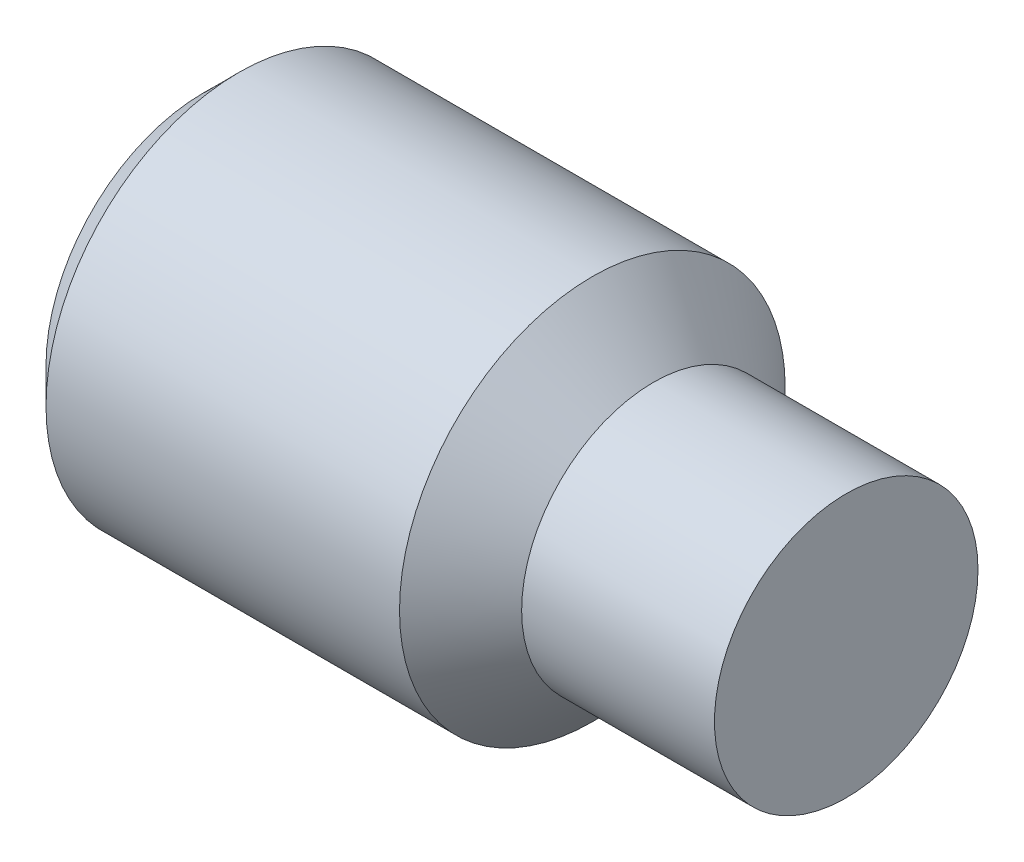
ISO-10303-21;
HEADER;
FILE_DESCRIPTION(('STEP AP214'),'2;1');
FILE_NAME('part.step','',(''),(''),'','','');
FILE_SCHEMA(('AUTOMOTIVE_DESIGN { 1 0 10303 214 1 1 1 1 }'));
ENDSEC;
DATA;
#1=APPLICATION_CONTEXT('core data for automotive mechanical design processes');
#2=APPLICATION_PROTOCOL_DEFINITION('international standard','automotive_design',2000,#1);
#3=PRODUCT_CONTEXT('',#1,'mechanical');
#4=PRODUCT('Part','Part','',(#3));
#5=PRODUCT_RELATED_PRODUCT_CATEGORY('part','',(#4));
#6=PRODUCT_DEFINITION_FORMATION('','',#4);
#7=PRODUCT_DEFINITION_CONTEXT('part definition',#1,'design');
#8=PRODUCT_DEFINITION('design','',#6,#7);
#9=PRODUCT_DEFINITION_SHAPE('','',#8);
#10=(LENGTH_UNIT() NAMED_UNIT(*) SI_UNIT(.MILLI.,.METRE.));
#11=(NAMED_UNIT(*) PLANE_ANGLE_UNIT() SI_UNIT($,.RADIAN.));
#12=(NAMED_UNIT(*) SI_UNIT($,.STERADIAN.) SOLID_ANGLE_UNIT());
#13=UNCERTAINTY_MEASURE_WITH_UNIT(LENGTH_MEASURE(1.E-05),#10,'distance_accuracy_value','');
#14=(GEOMETRIC_REPRESENTATION_CONTEXT(3) GLOBAL_UNCERTAINTY_ASSIGNED_CONTEXT((#13)) GLOBAL_UNIT_ASSIGNED_CONTEXT((#10,
#11,#12)) REPRESENTATION_CONTEXT('',''));
#15=CARTESIAN_POINT('',(0.,0.,0.));
#16=DIRECTION('',(0.,0.,1.));
#17=DIRECTION('',(1.,0.,0.));
#18=AXIS2_PLACEMENT_3D('',#15,#16,#17);
#19=CARTESIAN_POINT('',(20.,0.,0.));
#20=DIRECTION('',(-1.,0.,0.));
#21=DIRECTION('',(0.,0.,1.));
#22=AXIS2_PLACEMENT_3D('',#19,#20,#21);
#23=CYLINDRICAL_SURFACE('',#22,6.);
#24=CARTESIAN_POINT('',(12.1,0.,0.));
#25=DIRECTION('',(-1.,0.,0.));
#26=DIRECTION('',(0.,0.,1.));
#27=AXIS2_PLACEMENT_3D('',#24,#25,#26);
#28=CIRCLE('',#27,6.);
#29=CARTESIAN_POINT('',(12.1,0.,6.));
#30=VERTEX_POINT('',#29);
#31=EDGE_CURVE('E188',#30,#30,#28,.T.);
#32=ORIENTED_EDGE('',*,*,#31,.T.);
#33=EDGE_LOOP('',(#32));
#34=FACE_BOUND('',#33,.T.);
#35=CARTESIAN_POINT('',(1.09999999999999,0.,0.));
#36=DIRECTION('',(-1.,0.,0.));
#37=DIRECTION('',(0.,0.,1.));
#38=AXIS2_PLACEMENT_3D('',#35,#36,#37);
#39=CIRCLE('',#38,6.);
#40=CARTESIAN_POINT('',(1.09999999999999,0.,6.));
#41=VERTEX_POINT('',#40);
#42=EDGE_CURVE('E174',#41,#41,#39,.T.);
#43=ORIENTED_EDGE('',*,*,#42,.F.);
#44=EDGE_LOOP('',(#43));
#45=FACE_BOUND('',#44,.T.);
#46=ADVANCED_FACE('F29',(#34,#45),#23,.T.);
#47=CARTESIAN_POINT('',(14.,0.,0.));
#48=DIRECTION('',(-1.,0.,0.));
#49=DIRECTION('',(0.,0.,1.));
#50=AXIS2_PLACEMENT_3D('',#47,#48,#49);
#51=CONICAL_SURFACE('',#50,4.1,0.785398163397454);
#52=ORIENTED_EDGE('',*,*,#31,.F.);
#53=EDGE_LOOP('',(#52));
#54=FACE_BOUND('',#53,.T.);
#55=CARTESIAN_POINT('',(14.,0.,0.));
#56=DIRECTION('',(-1.,0.,0.));
#57=DIRECTION('',(0.,0.,1.));
#58=AXIS2_PLACEMENT_3D('',#55,#56,#57);
#59=CIRCLE('',#58,4.1);
#60=CARTESIAN_POINT('',(14.,0.,4.1));
#61=VERTEX_POINT('',#60);
#62=EDGE_CURVE('E185',#61,#61,#59,.T.);
#63=ORIENTED_EDGE('',*,*,#62,.T.);
#64=EDGE_LOOP('',(#63));
#65=FACE_BOUND('',#64,.T.);
#66=ADVANCED_FACE('F238',(#54,#65),#51,.T.);
#67=CARTESIAN_POINT('',(20.,0.,0.));
#68=DIRECTION('',(1.,0.,0.));
#69=DIRECTION('',(0.,0.,-1.));
#70=AXIS2_PLACEMENT_3D('',#67,#68,#69);
#71=PLANE('',#70);
#72=CARTESIAN_POINT('',(20.,0.,0.));
#73=DIRECTION('',(1.,0.,0.));
#74=DIRECTION('',(0.,0.,-1.));
#75=AXIS2_PLACEMENT_3D('',#72,#73,#74);
#76=CIRCLE('',#75,4.1);
#77=CARTESIAN_POINT('',(20.,0.,-4.1));
#78=VERTEX_POINT('',#77);
#79=EDGE_CURVE('E191',#78,#78,#76,.T.);
#80=ORIENTED_EDGE('',*,*,#79,.T.);
#81=EDGE_LOOP('',(#80));
#82=FACE_BOUND('',#81,.T.);
#83=ADVANCED_FACE('F244',(#82),#71,.T.);
#84=CARTESIAN_POINT('',(14.,0.,0.));
#85=DIRECTION('',(1.,0.,0.));
#86=DIRECTION('',(0.,0.,-1.));
#87=AXIS2_PLACEMENT_3D('',#84,#85,#86);
#88=CYLINDRICAL_SURFACE('',#87,4.1);
#89=ORIENTED_EDGE('',*,*,#62,.F.);
#90=EDGE_LOOP('',(#89));
#91=FACE_BOUND('',#90,.T.);
#92=ORIENTED_EDGE('',*,*,#79,.F.);
#93=EDGE_LOOP('',(#92));
#94=FACE_BOUND('',#93,.T.);
#95=ADVANCED_FACE('F253',(#91,#94),#88,.T.);
#96=CARTESIAN_POINT('',(0.,0.,0.));
#97=DIRECTION('',(1.,0.,0.));
#98=DIRECTION('',(0.,0.,-1.));
#99=AXIS2_PLACEMENT_3D('',#96,#97,#98);
#100=CONICAL_SURFACE('',#99,4.9,0.785398163397454);
#101=ORIENTED_EDGE('',*,*,#42,.T.);
#102=EDGE_LOOP('',(#101));
#103=FACE_BOUND('',#102,.T.);
#104=CARTESIAN_POINT('',(0.,0.,0.));
#105=DIRECTION('',(-1.,0.,0.));
#106=DIRECTION('',(0.,0.,1.));
#107=AXIS2_PLACEMENT_3D('',#104,#105,#106);
#108=CIRCLE('',#107,4.9);
#109=CARTESIAN_POINT('',(0.,0.,4.9));
#110=VERTEX_POINT('',#109);
#111=EDGE_CURVE('E177',#110,#110,#108,.T.);
#112=ORIENTED_EDGE('',*,*,#111,.F.);
#113=EDGE_LOOP('',(#112));
#114=FACE_BOUND('',#113,.T.);
#115=ADVANCED_FACE('F251',(#103,#114),#100,.T.);
#116=CARTESIAN_POINT('',(8.,-13.3414213562373,0.));
#117=DIRECTION('',(-1.,0.,0.));
#118=DIRECTION('',(0.,0.,1.));
#119=AXIS2_PLACEMENT_3D('',#116,#117,#118);
#120=PLANE('',#119);
#121=DIRECTION('',(0.,-0.499999999999998,-0.86602540378444));
#122=VECTOR('',#121,1.);
#123=CARTESIAN_POINT('',(8.,-1.6033045314904,-6.77700490854686));
#124=LINE('',#123,#122);
#125=CARTESIAN_POINT('',(8.,2.30940107675852,0.));
#126=VERTEX_POINT('',#125);
#127=CARTESIAN_POINT('',(8.,1.15470053837927,-2.));
#128=VERTEX_POINT('',#127);
#129=EDGE_CURVE('E145',#126,#128,#124,.T.);
#130=ORIENTED_EDGE('',*,*,#129,.T.);
#131=DIRECTION('',(0.,-1.,0.));
#132=VECTOR('',#131,1.);
#133=CARTESIAN_POINT('',(8.,-13.3414213562373,-2.));
#134=LINE('',#133,#132);
#135=CARTESIAN_POINT('',(8.,-1.15470053837927,-2.));
#136=VERTEX_POINT('',#135);
#137=EDGE_CURVE('E147',#128,#136,#134,.T.);
#138=ORIENTED_EDGE('',*,*,#137,.T.);
#139=DIRECTION('',(0.,-0.499999999999998,0.86602540378444));
#140=VECTOR('',#139,1.);
#141=CARTESIAN_POINT('',(8.,-5.06740614662819,4.77700490854686));
#142=LINE('',#141,#140);
#143=CARTESIAN_POINT('',(8.,-2.30940107675852,0.));
#144=VERTEX_POINT('',#143);
#145=EDGE_CURVE('E131',#136,#144,#142,.T.);
#146=ORIENTED_EDGE('',*,*,#145,.T.);
#147=DIRECTION('',(0.,0.499999999999998,0.86602540378444));
#148=VECTOR('',#147,1.);
#149=CARTESIAN_POINT('',(8.,-5.06740614662819,-4.77700490854686));
#150=LINE('',#149,#148);
#151=CARTESIAN_POINT('',(8.,-1.15470053837927,2.));
#152=VERTEX_POINT('',#151);
#153=EDGE_CURVE('E139',#144,#152,#150,.T.);
#154=ORIENTED_EDGE('',*,*,#153,.T.);
#155=DIRECTION('',(0.,1.,0.));
#156=VECTOR('',#155,1.);
#157=CARTESIAN_POINT('',(8.,-13.3414213562373,2.));
#158=LINE('',#157,#156);
#159=CARTESIAN_POINT('',(8.,1.15470053837927,2.));
#160=VERTEX_POINT('',#159);
#161=EDGE_CURVE('E141',#152,#160,#158,.T.);
#162=ORIENTED_EDGE('',*,*,#161,.T.);
#163=DIRECTION('',(0.,0.499999999999998,-0.86602540378444));
#164=VECTOR('',#163,1.);
#165=CARTESIAN_POINT('',(8.,-1.60330453149041,6.77700490854686));
#166=LINE('',#165,#164);
#167=EDGE_CURVE('E143',#160,#126,#166,.T.);
#168=ORIENTED_EDGE('',*,*,#167,.T.);
#169=EDGE_LOOP('',(#130,#138,#146,#154,#162,#168));
#170=FACE_BOUND('',#169,.T.);
#171=ADVANCED_FACE('F226',(#170),#120,.T.);
#172=CARTESIAN_POINT('',(8.,-13.3414213562373,3.));
#173=DIRECTION('',(0.,0.,1.));
#174=DIRECTION('',(1.,0.,0.));
#175=AXIS2_PLACEMENT_3D('',#172,#173,#174);
#176=PLANE('',#175);
#177=DIRECTION('',(-1.,0.,0.));
#178=VECTOR('',#177,1.);
#179=CARTESIAN_POINT('',(8.,1.73205080756889,3.));
#180=LINE('',#179,#178);
#181=CARTESIAN_POINT('',(7.,1.73205080756889,3.));
#182=VERTEX_POINT('',#181);
#183=CARTESIAN_POINT('',(0.,1.73205080756889,3.));
#184=VERTEX_POINT('',#183);
#185=EDGE_CURVE('E103',#182,#184,#180,.T.);
#186=ORIENTED_EDGE('',*,*,#185,.F.);
#187=DIRECTION('',(0.,1.,0.));
#188=VECTOR('',#187,1.);
#189=CARTESIAN_POINT('',(7.,-13.3414213562373,3.));
#190=LINE('',#189,#188);
#191=CARTESIAN_POINT('',(7.,-1.7320508075689,3.));
#192=VERTEX_POINT('',#191);
#193=EDGE_CURVE('E50',#182,#192,#190,.F.);
#194=ORIENTED_EDGE('',*,*,#193,.T.);
#195=DIRECTION('',(-1.,0.,0.));
#196=VECTOR('',#195,1.);
#197=CARTESIAN_POINT('',(8.,-1.7320508075689,3.));
#198=LINE('',#197,#196);
#199=CARTESIAN_POINT('',(0.,-1.7320508075689,3.));
#200=VERTEX_POINT('',#199);
#201=EDGE_CURVE('E96',#192,#200,#198,.T.);
#202=ORIENTED_EDGE('',*,*,#201,.T.);
#203=DIRECTION('',(0.,1.,0.));
#204=VECTOR('',#203,1.);
#205=CARTESIAN_POINT('',(0.,-13.3414213562373,3.));
#206=LINE('',#205,#204);
#207=EDGE_CURVE('E100',#200,#184,#206,.T.);
#208=ORIENTED_EDGE('',*,*,#207,.T.);
#209=EDGE_LOOP('',(#186,#194,#202,#208));
#210=FACE_BOUND('',#209,.T.);
#211=ADVANCED_FACE('F98',(#210),#176,.F.);
#212=CARTESIAN_POINT('',(8.,-0.737279127705975,7.27700490854686));
#213=DIRECTION('',(0.,0.86602540378444,0.499999999999998));
#214=DIRECTION('',(0.,-0.499999999999998,0.86602540378444));
#215=AXIS2_PLACEMENT_3D('',#212,#213,#214);
#216=PLANE('',#215);
#217=DIRECTION('',(-1.,0.,0.));
#218=VECTOR('',#217,1.);
#219=CARTESIAN_POINT('',(8.,3.46410161513777,0.));
#220=LINE('',#219,#218);
#221=CARTESIAN_POINT('',(7.,3.46410161513777,0.));
#222=VERTEX_POINT('',#221);
#223=CARTESIAN_POINT('',(0.,3.46410161513777,0.));
#224=VERTEX_POINT('',#223);
#225=EDGE_CURVE('E134',#222,#224,#220,.T.);
#226=ORIENTED_EDGE('',*,*,#225,.F.);
#227=DIRECTION('',(0.,0.499999999999998,-0.86602540378444));
#228=VECTOR('',#227,1.);
#229=CARTESIAN_POINT('',(7.,-0.737279127705975,7.27700490854686));
#230=LINE('',#229,#228);
#231=EDGE_CURVE('E155',#222,#182,#230,.F.);
#232=ORIENTED_EDGE('',*,*,#231,.T.);
#233=ORIENTED_EDGE('',*,*,#185,.T.);
#234=DIRECTION('',(0.,0.499999999999998,-0.86602540378444));
#235=VECTOR('',#234,1.);
#236=CARTESIAN_POINT('',(0.,-0.737279127705975,7.27700490854686));
#237=LINE('',#236,#235);
#238=EDGE_CURVE('E118',#184,#224,#237,.T.);
#239=ORIENTED_EDGE('',*,*,#238,.T.);
#240=EDGE_LOOP('',(#226,#232,#233,#239));
#241=FACE_BOUND('',#240,.T.);
#242=ADVANCED_FACE('F160',(#241),#216,.F.);
#243=CARTESIAN_POINT('',(8.,-0.737279127705962,-7.27700490854685));
#244=DIRECTION('',(0.,0.86602540378444,-0.499999999999998));
#245=DIRECTION('',(0.,0.499999999999998,0.86602540378444));
#246=AXIS2_PLACEMENT_3D('',#243,#244,#245);
#247=PLANE('',#246);
#248=DIRECTION('',(-1.,0.,0.));
#249=VECTOR('',#248,1.);
#250=CARTESIAN_POINT('',(8.,1.7320508075689,-3.));
#251=LINE('',#250,#249);
#252=CARTESIAN_POINT('',(7.,1.7320508075689,-3.));
#253=VERTEX_POINT('',#252);
#254=CARTESIAN_POINT('',(0.,1.7320508075689,-3.));
#255=VERTEX_POINT('',#254);
#256=EDGE_CURVE('E132',#253,#255,#251,.T.);
#257=ORIENTED_EDGE('',*,*,#256,.F.);
#258=DIRECTION('',(0.,-0.499999999999998,-0.86602540378444));
#259=VECTOR('',#258,1.);
#260=CARTESIAN_POINT('',(7.,-0.737279127705962,-7.27700490854685));
#261=LINE('',#260,#259);
#262=EDGE_CURVE('E153',#253,#222,#261,.F.);
#263=ORIENTED_EDGE('',*,*,#262,.T.);
#264=ORIENTED_EDGE('',*,*,#225,.T.);
#265=DIRECTION('',(0.,-0.499999999999998,-0.86602540378444));
#266=VECTOR('',#265,1.);
#267=CARTESIAN_POINT('',(0.,-0.737279127705962,-7.27700490854685));
#268=LINE('',#267,#266);
#269=EDGE_CURVE('E120',#224,#255,#268,.T.);
#270=ORIENTED_EDGE('',*,*,#269,.T.);
#271=EDGE_LOOP('',(#257,#263,#264,#270));
#272=FACE_BOUND('',#271,.T.);
#273=ADVANCED_FACE('F203',(#272),#247,.F.);
#274=CARTESIAN_POINT('',(8.,-13.3414213562373,-3.));
#275=DIRECTION('',(0.,0.,-1.));
#276=DIRECTION('',(-1.,0.,0.));
#277=AXIS2_PLACEMENT_3D('',#274,#275,#276);
#278=PLANE('',#277);
#279=DIRECTION('',(-1.,0.,0.));
#280=VECTOR('',#279,1.);
#281=CARTESIAN_POINT('',(8.,-1.7320508075689,-3.));
#282=LINE('',#281,#280);
#283=CARTESIAN_POINT('',(7.,-1.7320508075689,-3.));
#284=VERTEX_POINT('',#283);
#285=CARTESIAN_POINT('',(0.,-1.7320508075689,-3.));
#286=VERTEX_POINT('',#285);
#287=EDGE_CURVE('E129',#284,#286,#282,.T.);
#288=ORIENTED_EDGE('',*,*,#287,.F.);
#289=DIRECTION('',(0.,-1.,0.));
#290=VECTOR('',#289,1.);
#291=CARTESIAN_POINT('',(7.,-13.3414213562373,-3.));
#292=LINE('',#291,#290);
#293=EDGE_CURVE('E150',#284,#253,#292,.F.);
#294=ORIENTED_EDGE('',*,*,#293,.T.);
#295=ORIENTED_EDGE('',*,*,#256,.T.);
#296=DIRECTION('',(0.,-1.,0.));
#297=VECTOR('',#296,1.);
#298=CARTESIAN_POINT('',(0.,-13.3414213562373,-3.));
#299=LINE('',#298,#297);
#300=EDGE_CURVE('E126',#255,#286,#299,.T.);
#301=ORIENTED_EDGE('',*,*,#300,.T.);
#302=EDGE_LOOP('',(#288,#294,#295,#301));
#303=FACE_BOUND('',#302,.T.);
#304=ADVANCED_FACE('F199',(#303),#278,.F.);
#305=CARTESIAN_POINT('',(8.,-5.93343155041263,4.27700490854686));
#306=DIRECTION('',(0.,-0.86602540378444,-0.499999999999998));
#307=DIRECTION('',(0.,0.499999999999998,-0.86602540378444));
#308=AXIS2_PLACEMENT_3D('',#305,#306,#307);
#309=PLANE('',#308);
#310=DIRECTION('',(-1.,0.,0.));
#311=VECTOR('',#310,1.);
#312=CARTESIAN_POINT('',(8.,-3.46410161513776,0.));
#313=LINE('',#312,#311);
#314=CARTESIAN_POINT('',(7.,-3.46410161513776,0.));
#315=VERTEX_POINT('',#314);
#316=CARTESIAN_POINT('',(0.,-3.46410161513777,0.));
#317=VERTEX_POINT('',#316);
#318=EDGE_CURVE('E104',#315,#317,#313,.T.);
#319=ORIENTED_EDGE('',*,*,#318,.F.);
#320=DIRECTION('',(0.,-0.499999999999998,0.86602540378444));
#321=VECTOR('',#320,1.);
#322=CARTESIAN_POINT('',(7.,-5.93343155041263,4.27700490854686));
#323=LINE('',#322,#321);
#324=EDGE_CURVE('E11',#315,#284,#323,.F.);
#325=ORIENTED_EDGE('',*,*,#324,.T.);
#326=ORIENTED_EDGE('',*,*,#287,.T.);
#327=DIRECTION('',(0.,-0.499999999999998,0.86602540378444));
#328=VECTOR('',#327,1.);
#329=CARTESIAN_POINT('',(0.,-5.93343155041263,4.27700490854686));
#330=LINE('',#329,#328);
#331=EDGE_CURVE('E112',#286,#317,#330,.T.);
#332=ORIENTED_EDGE('',*,*,#331,.T.);
#333=EDGE_LOOP('',(#319,#325,#326,#332));
#334=FACE_BOUND('',#333,.T.);
#335=ADVANCED_FACE('F194',(#334),#309,.F.);
#336=CARTESIAN_POINT('',(8.,-5.93343155041263,-4.27700490854686));
#337=DIRECTION('',(0.,-0.86602540378444,0.499999999999998));
#338=DIRECTION('',(0.,-0.499999999999998,-0.86602540378444));
#339=AXIS2_PLACEMENT_3D('',#336,#337,#338);
#340=PLANE('',#339);
#341=ORIENTED_EDGE('',*,*,#201,.F.);
#342=DIRECTION('',(0.,0.499999999999998,0.86602540378444));
#343=VECTOR('',#342,1.);
#344=CARTESIAN_POINT('',(7.,-5.93343155041263,-4.27700490854686));
#345=LINE('',#344,#343);
#346=EDGE_CURVE('E36',#192,#315,#345,.F.);
#347=ORIENTED_EDGE('',*,*,#346,.T.);
#348=ORIENTED_EDGE('',*,*,#318,.T.);
#349=DIRECTION('',(0.,0.499999999999998,0.86602540378444));
#350=VECTOR('',#349,1.);
#351=CARTESIAN_POINT('',(0.,-5.93343155041263,-4.27700490854686));
#352=LINE('',#351,#350);
#353=EDGE_CURVE('E107',#317,#200,#352,.T.);
#354=ORIENTED_EDGE('',*,*,#353,.T.);
#355=EDGE_LOOP('',(#341,#347,#348,#354));
#356=FACE_BOUND('',#355,.T.);
#357=ADVANCED_FACE('F108',(#356),#340,.F.);
#358=CARTESIAN_POINT('',(0.,0.,0.));
#359=DIRECTION('',(1.,0.,0.));
#360=DIRECTION('',(0.,0.,-1.));
#361=AXIS2_PLACEMENT_3D('',#358,#359,#360);
#362=PLANE('',#361);
#363=ORIENTED_EDGE('',*,*,#353,.F.);
#364=ORIENTED_EDGE('',*,*,#331,.F.);
#365=ORIENTED_EDGE('',*,*,#300,.F.);
#366=ORIENTED_EDGE('',*,*,#269,.F.);
#367=ORIENTED_EDGE('',*,*,#238,.F.);
#368=ORIENTED_EDGE('',*,*,#207,.F.);
#369=EDGE_LOOP('',(#363,#364,#365,#366,#367,#368));
#370=FACE_BOUND('',#369,.T.);
#371=ORIENTED_EDGE('',*,*,#111,.T.);
#372=EDGE_LOOP('',(#371));
#373=FACE_BOUND('',#372,.T.);
#374=ADVANCED_FACE('F114',(#370,#373),#362,.F.);
#375=CARTESIAN_POINT('',(7.,-13.3414213562373,2.));
#376=DIRECTION('',(0.,1.,0.));
#377=DIRECTION('',(0.,0.,1.));
#378=AXIS2_PLACEMENT_3D('',#375,#376,#377);
#379=CYLINDRICAL_SURFACE('',#378,1.);
#380=CARTESIAN_POINT('',(7.,-1.15470053837927,2.));
#381=DIRECTION('',(0.,0.866025403784438,0.500000000000001));
#382=DIRECTION('',(0.,0.500000000000001,-0.866025403784438));
#383=AXIS2_PLACEMENT_3D('',#380,#381,#382);
#384=ELLIPSE('',#383,1.15470053837925,1.);
#385=EDGE_CURVE('E172',#192,#152,#384,.T.);
#386=ORIENTED_EDGE('',*,*,#385,.F.);
#387=ORIENTED_EDGE('',*,*,#193,.F.);
#388=CARTESIAN_POINT('',(7.,1.15470053837927,2.));
#389=DIRECTION('',(0.,0.866025403784438,-0.500000000000001));
#390=DIRECTION('',(0.,-0.500000000000001,-0.866025403784438));
#391=AXIS2_PLACEMENT_3D('',#388,#389,#390);
#392=ELLIPSE('',#391,1.15470053837925,1.);
#393=EDGE_CURVE('E169',#160,#182,#392,.F.);
#394=ORIENTED_EDGE('',*,*,#393,.F.);
#395=ORIENTED_EDGE('',*,*,#161,.F.);
#396=EDGE_LOOP('',(#386,#387,#394,#395));
#397=FACE_BOUND('',#396,.T.);
#398=ADVANCED_FACE('F167',(#397),#379,.F.);
#399=CARTESIAN_POINT('',(7.,-1.60330453149041,6.77700490854686));
#400=DIRECTION('',(0.,0.499999999999998,-0.86602540378444));
#401=DIRECTION('',(0.,0.86602540378444,0.499999999999998));
#402=AXIS2_PLACEMENT_3D('',#399,#400,#401);
#403=CYLINDRICAL_SURFACE('',#402,1.);
#404=ORIENTED_EDGE('',*,*,#393,.T.);
#405=ORIENTED_EDGE('',*,*,#231,.F.);
#406=CARTESIAN_POINT('',(7.,2.30940107675852,0.));
#407=DIRECTION('',(0.,0.,-1.));
#408=DIRECTION('',(0.,-1.,0.));
#409=AXIS2_PLACEMENT_3D('',#406,#407,#408);
#410=ELLIPSE('',#409,1.15470053837925,1.);
#411=EDGE_CURVE('E179',#126,#222,#410,.F.);
#412=ORIENTED_EDGE('',*,*,#411,.F.);
#413=ORIENTED_EDGE('',*,*,#167,.F.);
#414=EDGE_LOOP('',(#404,#405,#412,#413));
#415=FACE_BOUND('',#414,.T.);
#416=ADVANCED_FACE('F173',(#415),#403,.F.);
#417=CARTESIAN_POINT('',(7.,-5.06740614662819,-4.77700490854686));
#418=DIRECTION('',(0.,0.499999999999998,0.86602540378444));
#419=DIRECTION('',(0.,-0.86602540378444,0.499999999999998));
#420=AXIS2_PLACEMENT_3D('',#417,#418,#419);
#421=CYLINDRICAL_SURFACE('',#420,1.);
#422=ORIENTED_EDGE('',*,*,#385,.T.);
#423=ORIENTED_EDGE('',*,*,#153,.F.);
#424=CARTESIAN_POINT('',(7.,-2.30940107675851,0.));
#425=DIRECTION('',(0.,0.,1.));
#426=DIRECTION('',(0.,1.,0.));
#427=AXIS2_PLACEMENT_3D('',#424,#425,#426);
#428=ELLIPSE('',#427,1.15470053837925,1.);
#429=EDGE_CURVE('E211',#315,#144,#428,.T.);
#430=ORIENTED_EDGE('',*,*,#429,.F.);
#431=ORIENTED_EDGE('',*,*,#346,.F.);
#432=EDGE_LOOP('',(#422,#423,#430,#431));
#433=FACE_BOUND('',#432,.T.);
#434=ADVANCED_FACE('F228',(#433),#421,.F.);
#435=CARTESIAN_POINT('',(7.,-1.6033045314904,-6.77700490854686));
#436=DIRECTION('',(0.,-0.499999999999998,-0.86602540378444));
#437=DIRECTION('',(0.,0.86602540378444,-0.499999999999998));
#438=AXIS2_PLACEMENT_3D('',#435,#436,#437);
#439=CYLINDRICAL_SURFACE('',#438,1.);
#440=ORIENTED_EDGE('',*,*,#411,.T.);
#441=ORIENTED_EDGE('',*,*,#262,.F.);
#442=CARTESIAN_POINT('',(7.,1.15470053837927,-2.));
#443=DIRECTION('',(0.,-0.866025403784438,-0.500000000000001));
#444=DIRECTION('',(0.,-0.500000000000001,0.866025403784438));
#445=AXIS2_PLACEMENT_3D('',#442,#443,#444);
#446=ELLIPSE('',#445,1.15470053837925,1.);
#447=EDGE_CURVE('E209',#128,#253,#446,.F.);
#448=ORIENTED_EDGE('',*,*,#447,.F.);
#449=ORIENTED_EDGE('',*,*,#129,.F.);
#450=EDGE_LOOP('',(#440,#441,#448,#449));
#451=FACE_BOUND('',#450,.T.);
#452=ADVANCED_FACE('F207',(#451),#439,.F.);
#453=CARTESIAN_POINT('',(7.,-5.06740614662819,4.77700490854685));
#454=DIRECTION('',(0.,-0.499999999999998,0.86602540378444));
#455=DIRECTION('',(0.,-0.86602540378444,-0.499999999999998));
#456=AXIS2_PLACEMENT_3D('',#453,#454,#455);
#457=CYLINDRICAL_SURFACE('',#456,1.);
#458=ORIENTED_EDGE('',*,*,#429,.T.);
#459=ORIENTED_EDGE('',*,*,#145,.F.);
#460=CARTESIAN_POINT('',(7.,-1.15470053837927,-2.));
#461=DIRECTION('',(0.,-0.866025403784438,0.500000000000001));
#462=DIRECTION('',(0.,-0.500000000000001,-0.866025403784438));
#463=AXIS2_PLACEMENT_3D('',#460,#461,#462);
#464=ELLIPSE('',#463,1.15470053837925,1.);
#465=EDGE_CURVE('E216',#284,#136,#464,.T.);
#466=ORIENTED_EDGE('',*,*,#465,.F.);
#467=ORIENTED_EDGE('',*,*,#324,.F.);
#468=EDGE_LOOP('',(#458,#459,#466,#467));
#469=FACE_BOUND('',#468,.T.);
#470=ADVANCED_FACE('F223',(#469),#457,.F.);
#471=CARTESIAN_POINT('',(7.,-13.3414213562373,-2.));
#472=DIRECTION('',(0.,-1.,0.));
#473=DIRECTION('',(0.,0.,-1.));
#474=AXIS2_PLACEMENT_3D('',#471,#472,#473);
#475=CYLINDRICAL_SURFACE('',#474,1.);
#476=ORIENTED_EDGE('',*,*,#447,.T.);
#477=ORIENTED_EDGE('',*,*,#293,.F.);
#478=ORIENTED_EDGE('',*,*,#465,.T.);
#479=ORIENTED_EDGE('',*,*,#137,.F.);
#480=EDGE_LOOP('',(#476,#477,#478,#479));
#481=FACE_BOUND('',#480,.T.);
#482=ADVANCED_FACE('F220',(#481),#475,.F.);
#483=CLOSED_SHELL('',(#46,#66,#83,#95,#115,#171,#211,#242,#273,#304,#335,#357,#374,#398,#416,
#434,#452,#470,#482));
#484=MANIFOLD_SOLID_BREP('B2',#483);
#485=ADVANCED_BREP_SHAPE_REPRESENTATION('',(#18,#484),#14);
#486=SHAPE_DEFINITION_REPRESENTATION(#9,#485);
ENDSEC;
END-ISO-10303-21;
